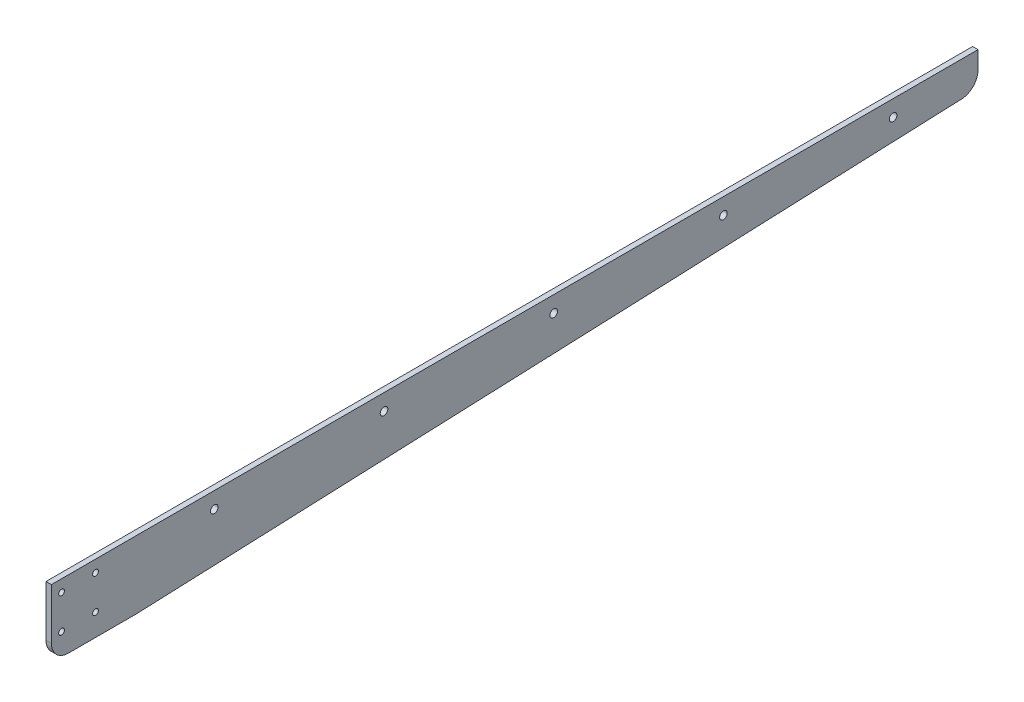
ISO-10303-21;
HEADER;
FILE_DESCRIPTION(('STEP AP214'),'2;1');
FILE_NAME('part.step','',(''),(''),'','','');
FILE_SCHEMA(('AUTOMOTIVE_DESIGN { 1 0 10303 214 1 1 1 1 }'));
ENDSEC;
DATA;
#1=APPLICATION_CONTEXT('core data for automotive mechanical design processes');
#2=APPLICATION_PROTOCOL_DEFINITION('international standard','automotive_design',2000,#1);
#3=PRODUCT_CONTEXT('',#1,'mechanical');
#4=PRODUCT('Part','Part','',(#3));
#5=PRODUCT_RELATED_PRODUCT_CATEGORY('part','',(#4));
#6=PRODUCT_DEFINITION_FORMATION('','',#4);
#7=PRODUCT_DEFINITION_CONTEXT('part definition',#1,'design');
#8=PRODUCT_DEFINITION('design','',#6,#7);
#9=PRODUCT_DEFINITION_SHAPE('','',#8);
#10=(LENGTH_UNIT() NAMED_UNIT(*) SI_UNIT(.MILLI.,.METRE.));
#11=(NAMED_UNIT(*) PLANE_ANGLE_UNIT() SI_UNIT($,.RADIAN.));
#12=(NAMED_UNIT(*) SI_UNIT($,.STERADIAN.) SOLID_ANGLE_UNIT());
#13=UNCERTAINTY_MEASURE_WITH_UNIT(LENGTH_MEASURE(1.E-05),#10,'distance_accuracy_value','');
#14=(GEOMETRIC_REPRESENTATION_CONTEXT(3) GLOBAL_UNCERTAINTY_ASSIGNED_CONTEXT((#13)) GLOBAL_UNIT_ASSIGNED_CONTEXT((#10,
#11,#12)) REPRESENTATION_CONTEXT('',''));
#15=CARTESIAN_POINT('',(0.,0.,0.));
#16=DIRECTION('',(0.,0.,1.));
#17=DIRECTION('',(1.,0.,0.));
#18=AXIS2_PLACEMENT_3D('',#15,#16,#17);
#19=CARTESIAN_POINT('',(3.175,0.,0.));
#20=DIRECTION('',(-1.,0.,0.));
#21=DIRECTION('',(0.,0.,1.));
#22=AXIS2_PLACEMENT_3D('',#19,#20,#21);
#23=PLANE('',#22);
#24=CARTESIAN_POINT('',(3.175,30.475,-296.));
#25=DIRECTION('',(1.,0.,0.));
#26=DIRECTION('',(0.,0.,-1.));
#27=AXIS2_PLACEMENT_3D('',#24,#25,#26);
#28=CIRCLE('',#27,2.24789999999998);
#29=CARTESIAN_POINT('',(3.175,30.475,-298.2479));
#30=VERTEX_POINT('',#29);
#31=EDGE_CURVE('E254',#30,#30,#28,.T.);
#32=ORIENTED_EDGE('',*,*,#31,.F.);
#33=EDGE_LOOP('',(#32));
#34=FACE_BOUND('',#33,.T.);
#35=CARTESIAN_POINT('',(3.175,30.475,-396.));
#36=DIRECTION('',(1.,0.,0.));
#37=DIRECTION('',(0.,0.,-1.));
#38=AXIS2_PLACEMENT_3D('',#35,#36,#37);
#39=CIRCLE('',#38,2.24789999999998);
#40=CARTESIAN_POINT('',(3.175,30.475,-398.2479));
#41=VERTEX_POINT('',#40);
#42=EDGE_CURVE('E260',#41,#41,#39,.T.);
#43=ORIENTED_EDGE('',*,*,#42,.F.);
#44=EDGE_LOOP('',(#43));
#45=FACE_BOUND('',#44,.T.);
#46=CARTESIAN_POINT('',(3.175,30.475,-496.));
#47=DIRECTION('',(1.,0.,0.));
#48=DIRECTION('',(0.,0.,-1.));
#49=AXIS2_PLACEMENT_3D('',#46,#47,#48);
#50=CIRCLE('',#49,2.24789999999998);
#51=CARTESIAN_POINT('',(3.175,30.475,-498.2479));
#52=VERTEX_POINT('',#51);
#53=EDGE_CURVE('E266',#52,#52,#50,.T.);
#54=ORIENTED_EDGE('',*,*,#53,.F.);
#55=EDGE_LOOP('',(#54));
#56=FACE_BOUND('',#55,.T.);
#57=CARTESIAN_POINT('',(3.175,33.,-26.));
#58=DIRECTION('',(1.,0.,0.));
#59=DIRECTION('',(0.,0.,-1.));
#60=AXIS2_PLACEMENT_3D('',#57,#58,#59);
#61=CIRCLE('',#60,1.7);
#62=CARTESIAN_POINT('',(3.175,33.,-27.7));
#63=VERTEX_POINT('',#62);
#64=EDGE_CURVE('E272',#63,#63,#61,.T.);
#65=ORIENTED_EDGE('',*,*,#64,.F.);
#66=EDGE_LOOP('',(#65));
#67=FACE_BOUND('',#66,.T.);
#68=CARTESIAN_POINT('',(3.175,33.,-6.));
#69=DIRECTION('',(1.,0.,0.));
#70=DIRECTION('',(0.,0.,-1.));
#71=AXIS2_PLACEMENT_3D('',#68,#69,#70);
#72=CIRCLE('',#71,1.7);
#73=CARTESIAN_POINT('',(3.175,33.,-7.7));
#74=VERTEX_POINT('',#73);
#75=EDGE_CURVE('E278',#74,#74,#72,.T.);
#76=ORIENTED_EDGE('',*,*,#75,.F.);
#77=EDGE_LOOP('',(#76));
#78=FACE_BOUND('',#77,.T.);
#79=CARTESIAN_POINT('',(3.175,13.,-26.));
#80=DIRECTION('',(1.,0.,0.));
#81=DIRECTION('',(0.,0.,-1.));
#82=AXIS2_PLACEMENT_3D('',#79,#80,#81);
#83=CIRCLE('',#82,1.7);
#84=CARTESIAN_POINT('',(3.175,13.,-27.7));
#85=VERTEX_POINT('',#84);
#86=EDGE_CURVE('E284',#85,#85,#83,.T.);
#87=ORIENTED_EDGE('',*,*,#86,.F.);
#88=EDGE_LOOP('',(#87));
#89=FACE_BOUND('',#88,.T.);
#90=CARTESIAN_POINT('',(3.175,13.,-6.));
#91=DIRECTION('',(1.,0.,0.));
#92=DIRECTION('',(0.,0.,-1.));
#93=AXIS2_PLACEMENT_3D('',#90,#91,#92);
#94=CIRCLE('',#93,1.7);
#95=CARTESIAN_POINT('',(3.175,13.,-7.7));
#96=VERTEX_POINT('',#95);
#97=EDGE_CURVE('E290',#96,#96,#94,.T.);
#98=ORIENTED_EDGE('',*,*,#97,.F.);
#99=EDGE_LOOP('',(#98));
#100=FACE_BOUND('',#99,.T.);
#101=DIRECTION('',(0.,0.,-1.));
#102=VECTOR('',#101,1.);
#103=CARTESIAN_POINT('',(3.175,0.,-50.));
#104=LINE('',#103,#102);
#105=CARTESIAN_POINT('',(3.175,0.,-10.));
#106=VERTEX_POINT('',#105);
#107=CARTESIAN_POINT('',(3.175,0.,-49.7984689813537));
#108=VERTEX_POINT('',#107);
#109=EDGE_CURVE('E139',#106,#108,#104,.T.);
#110=ORIENTED_EDGE('',*,*,#109,.T.);
#111=CARTESIAN_POINT('',(3.175,10.,-49.7984689813537));
#112=DIRECTION('',(-1.,0.,0.));
#113=DIRECTION('',(0.,0.,1.));
#114=AXIS2_PLACEMENT_3D('',#111,#112,#113);
#115=CIRCLE('',#114,10.);
#116=CARTESIAN_POINT('',(3.175,0.00811965251863028,-50.2013673824619));
#117=VERTEX_POINT('',#116);
#118=EDGE_CURVE('E159',#108,#117,#115,.F.);
#119=ORIENTED_EDGE('',*,*,#118,.T.);
#120=DIRECTION('',(0.,0.040289840110812,-0.999188034748137));
#121=VECTOR('',#120,1.);
#122=CARTESIAN_POINT('',(3.175,20.,-546.));
#123=LINE('',#122,#121);
#124=CARTESIAN_POINT('',(3.175,19.6130200968189,-536.402898401108));
#125=VERTEX_POINT('',#124);
#126=EDGE_CURVE('E108',#117,#125,#123,.T.);
#127=ORIENTED_EDGE('',*,*,#126,.T.);
#128=CARTESIAN_POINT('',(3.175,29.6049004443002,-536.));
#129=DIRECTION('',(-1.,0.,0.));
#130=DIRECTION('',(0.,0.,1.));
#131=AXIS2_PLACEMENT_3D('',#128,#129,#130);
#132=CIRCLE('',#131,10.);
#133=CARTESIAN_POINT('',(3.175,29.6049004443002,-546.));
#134=VERTEX_POINT('',#133);
#135=EDGE_CURVE('E57',#125,#134,#132,.F.);
#136=ORIENTED_EDGE('',*,*,#135,.T.);
#137=DIRECTION('',(0.,1.,0.));
#138=VECTOR('',#137,1.);
#139=CARTESIAN_POINT('',(3.175,40.,-546.));
#140=LINE('',#139,#138);
#141=CARTESIAN_POINT('',(3.175,40.,-546.));
#142=VERTEX_POINT('',#141);
#143=EDGE_CURVE('E99',#134,#142,#140,.T.);
#144=ORIENTED_EDGE('',*,*,#143,.T.);
#145=DIRECTION('',(0.,0.,1.));
#146=VECTOR('',#145,1.);
#147=CARTESIAN_POINT('',(3.175,40.,0.));
#148=LINE('',#147,#146);
#149=CARTESIAN_POINT('',(3.175,40.,0.));
#150=VERTEX_POINT('',#149);
#151=EDGE_CURVE('E104',#142,#150,#148,.T.);
#152=ORIENTED_EDGE('',*,*,#151,.T.);
#153=DIRECTION('',(0.,-1.,0.));
#154=VECTOR('',#153,1.);
#155=CARTESIAN_POINT('',(3.175,0.,0.));
#156=LINE('',#155,#154);
#157=CARTESIAN_POINT('',(3.175,10.,0.));
#158=VERTEX_POINT('',#157);
#159=EDGE_CURVE('E122',#150,#158,#156,.T.);
#160=ORIENTED_EDGE('',*,*,#159,.T.);
#161=CARTESIAN_POINT('',(3.175,10.,-10.));
#162=DIRECTION('',(-1.,0.,0.));
#163=DIRECTION('',(0.,0.,1.));
#164=AXIS2_PLACEMENT_3D('',#161,#162,#163);
#165=CIRCLE('',#164,10.);
#166=EDGE_CURVE('E157',#158,#106,#165,.F.);
#167=ORIENTED_EDGE('',*,*,#166,.T.);
#168=EDGE_LOOP('',(#110,#119,#127,#136,#144,#152,#160,#167));
#169=FACE_BOUND('',#168,.T.);
#170=CARTESIAN_POINT('',(3.175,30.475,-196.));
#171=DIRECTION('',(1.,0.,0.));
#172=DIRECTION('',(0.,0.,-1.));
#173=AXIS2_PLACEMENT_3D('',#170,#171,#172);
#174=CIRCLE('',#173,2.24789999999998);
#175=CARTESIAN_POINT('',(3.175,30.475,-198.2479));
#176=VERTEX_POINT('',#175);
#177=EDGE_CURVE('E246',#176,#176,#174,.T.);
#178=ORIENTED_EDGE('',*,*,#177,.F.);
#179=EDGE_LOOP('',(#178));
#180=FACE_BOUND('',#179,.T.);
#181=CARTESIAN_POINT('',(3.175,30.475,-96.));
#182=DIRECTION('',(1.,0.,0.));
#183=DIRECTION('',(0.,0.,-1.));
#184=AXIS2_PLACEMENT_3D('',#181,#182,#183);
#185=CIRCLE('',#184,2.24789999999998);
#186=CARTESIAN_POINT('',(3.175,30.475,-98.2479));
#187=VERTEX_POINT('',#186);
#188=EDGE_CURVE('E243',#187,#187,#185,.T.);
#189=ORIENTED_EDGE('',*,*,#188,.F.);
#190=EDGE_LOOP('',(#189));
#191=FACE_BOUND('',#190,.T.);
#192=ADVANCED_FACE('F35',(#34,#45,#56,#67,#78,#89,#100,#169,#180,#191),#23,.F.);
#193=CARTESIAN_POINT('',(0.,0.,0.));
#194=DIRECTION('',(-1.,0.,0.));
#195=DIRECTION('',(0.,0.,1.));
#196=AXIS2_PLACEMENT_3D('',#193,#194,#195);
#197=PLANE('',#196);
#198=CARTESIAN_POINT('',(0.,30.475,-96.));
#199=DIRECTION('',(1.,0.,0.));
#200=DIRECTION('',(0.,0.,-1.));
#201=AXIS2_PLACEMENT_3D('',#198,#199,#200);
#202=CIRCLE('',#201,2.2479);
#203=CARTESIAN_POINT('',(0.,30.475,-98.2479));
#204=VERTEX_POINT('',#203);
#205=EDGE_CURVE('E240',#204,#204,#202,.T.);
#206=ORIENTED_EDGE('',*,*,#205,.T.);
#207=EDGE_LOOP('',(#206));
#208=FACE_BOUND('',#207,.T.);
#209=CARTESIAN_POINT('',(0.,30.475,-396.));
#210=DIRECTION('',(1.,0.,0.));
#211=DIRECTION('',(0.,0.,-1.));
#212=AXIS2_PLACEMENT_3D('',#209,#210,#211);
#213=CIRCLE('',#212,2.2479);
#214=CARTESIAN_POINT('',(0.,30.475,-398.2479));
#215=VERTEX_POINT('',#214);
#216=EDGE_CURVE('E263',#215,#215,#213,.T.);
#217=ORIENTED_EDGE('',*,*,#216,.T.);
#218=EDGE_LOOP('',(#217));
#219=FACE_BOUND('',#218,.T.);
#220=CARTESIAN_POINT('',(0.,30.475,-496.));
#221=DIRECTION('',(1.,0.,0.));
#222=DIRECTION('',(0.,0.,-1.));
#223=AXIS2_PLACEMENT_3D('',#220,#221,#222);
#224=CIRCLE('',#223,2.2479);
#225=CARTESIAN_POINT('',(0.,30.475,-498.2479));
#226=VERTEX_POINT('',#225);
#227=EDGE_CURVE('E269',#226,#226,#224,.T.);
#228=ORIENTED_EDGE('',*,*,#227,.T.);
#229=EDGE_LOOP('',(#228));
#230=FACE_BOUND('',#229,.T.);
#231=CARTESIAN_POINT('',(0.,33.,-26.));
#232=DIRECTION('',(1.,0.,0.));
#233=DIRECTION('',(0.,0.,-1.));
#234=AXIS2_PLACEMENT_3D('',#231,#232,#233);
#235=CIRCLE('',#234,1.7);
#236=CARTESIAN_POINT('',(0.,33.,-27.7));
#237=VERTEX_POINT('',#236);
#238=EDGE_CURVE('E275',#237,#237,#235,.T.);
#239=ORIENTED_EDGE('',*,*,#238,.T.);
#240=EDGE_LOOP('',(#239));
#241=FACE_BOUND('',#240,.T.);
#242=CARTESIAN_POINT('',(0.,33.,-6.));
#243=DIRECTION('',(1.,0.,0.));
#244=DIRECTION('',(0.,0.,-1.));
#245=AXIS2_PLACEMENT_3D('',#242,#243,#244);
#246=CIRCLE('',#245,1.7);
#247=CARTESIAN_POINT('',(0.,33.,-7.7));
#248=VERTEX_POINT('',#247);
#249=EDGE_CURVE('E281',#248,#248,#246,.T.);
#250=ORIENTED_EDGE('',*,*,#249,.T.);
#251=EDGE_LOOP('',(#250));
#252=FACE_BOUND('',#251,.T.);
#253=CARTESIAN_POINT('',(0.,13.,-26.));
#254=DIRECTION('',(1.,0.,0.));
#255=DIRECTION('',(0.,0.,-1.));
#256=AXIS2_PLACEMENT_3D('',#253,#254,#255);
#257=CIRCLE('',#256,1.7);
#258=CARTESIAN_POINT('',(0.,13.,-27.7));
#259=VERTEX_POINT('',#258);
#260=EDGE_CURVE('E287',#259,#259,#257,.T.);
#261=ORIENTED_EDGE('',*,*,#260,.T.);
#262=EDGE_LOOP('',(#261));
#263=FACE_BOUND('',#262,.T.);
#264=CARTESIAN_POINT('',(0.,13.,-6.));
#265=DIRECTION('',(1.,0.,0.));
#266=DIRECTION('',(0.,0.,-1.));
#267=AXIS2_PLACEMENT_3D('',#264,#265,#266);
#268=CIRCLE('',#267,1.7);
#269=CARTESIAN_POINT('',(0.,13.,-7.7));
#270=VERTEX_POINT('',#269);
#271=EDGE_CURVE('E131',#270,#270,#268,.T.);
#272=ORIENTED_EDGE('',*,*,#271,.T.);
#273=EDGE_LOOP('',(#272));
#274=FACE_BOUND('',#273,.T.);
#275=DIRECTION('',(0.,0.040289840110812,-0.999188034748137));
#276=VECTOR('',#275,1.);
#277=CARTESIAN_POINT('',(0.,20.,-546.));
#278=LINE('',#277,#276);
#279=CARTESIAN_POINT('',(0.,0.00811965251863028,-50.2013673824619));
#280=VERTEX_POINT('',#279);
#281=CARTESIAN_POINT('',(0.,19.6130200968189,-536.402898401108));
#282=VERTEX_POINT('',#281);
#283=EDGE_CURVE('E130',#280,#282,#278,.T.);
#284=ORIENTED_EDGE('',*,*,#283,.F.);
#285=CARTESIAN_POINT('',(0.,10.,-49.7984689813537));
#286=DIRECTION('',(-1.,0.,0.));
#287=DIRECTION('',(0.,0.,1.));
#288=AXIS2_PLACEMENT_3D('',#285,#286,#287);
#289=CIRCLE('',#288,10.);
#290=CARTESIAN_POINT('',(0.,0.,-49.7984689813537));
#291=VERTEX_POINT('',#290);
#292=EDGE_CURVE('E149',#280,#291,#289,.T.);
#293=ORIENTED_EDGE('',*,*,#292,.T.);
#294=DIRECTION('',(0.,0.,-1.));
#295=VECTOR('',#294,1.);
#296=CARTESIAN_POINT('',(0.,0.,-50.));
#297=LINE('',#296,#295);
#298=CARTESIAN_POINT('',(0.,0.,-10.));
#299=VERTEX_POINT('',#298);
#300=EDGE_CURVE('E127',#299,#291,#297,.T.);
#301=ORIENTED_EDGE('',*,*,#300,.F.);
#302=CARTESIAN_POINT('',(0.,10.,-10.));
#303=DIRECTION('',(-1.,0.,0.));
#304=DIRECTION('',(0.,0.,1.));
#305=AXIS2_PLACEMENT_3D('',#302,#303,#304);
#306=CIRCLE('',#305,10.);
#307=CARTESIAN_POINT('',(0.,10.,0.));
#308=VERTEX_POINT('',#307);
#309=EDGE_CURVE('E147',#299,#308,#306,.T.);
#310=ORIENTED_EDGE('',*,*,#309,.T.);
#311=DIRECTION('',(0.,-1.,0.));
#312=VECTOR('',#311,1.);
#313=CARTESIAN_POINT('',(0.,0.,0.));
#314=LINE('',#313,#312);
#315=CARTESIAN_POINT('',(0.,40.,0.));
#316=VERTEX_POINT('',#315);
#317=EDGE_CURVE('E137',#316,#308,#314,.T.);
#318=ORIENTED_EDGE('',*,*,#317,.F.);
#319=DIRECTION('',(0.,0.,1.));
#320=VECTOR('',#319,1.);
#321=CARTESIAN_POINT('',(0.,40.,0.));
#322=LINE('',#321,#320);
#323=CARTESIAN_POINT('',(0.,40.,-546.));
#324=VERTEX_POINT('',#323);
#325=EDGE_CURVE('E135',#324,#316,#322,.T.);
#326=ORIENTED_EDGE('',*,*,#325,.F.);
#327=DIRECTION('',(0.,1.,0.));
#328=VECTOR('',#327,1.);
#329=CARTESIAN_POINT('',(0.,40.,-546.));
#330=LINE('',#329,#328);
#331=CARTESIAN_POINT('',(0.,29.6049004443002,-546.));
#332=VERTEX_POINT('',#331);
#333=EDGE_CURVE('E114',#332,#324,#330,.T.);
#334=ORIENTED_EDGE('',*,*,#333,.F.);
#335=CARTESIAN_POINT('',(0.,29.6049004443002,-536.));
#336=DIRECTION('',(-1.,0.,0.));
#337=DIRECTION('',(0.,0.,1.));
#338=AXIS2_PLACEMENT_3D('',#335,#336,#337);
#339=CIRCLE('',#338,10.);
#340=EDGE_CURVE('E145',#332,#282,#339,.T.);
#341=ORIENTED_EDGE('',*,*,#340,.T.);
#342=EDGE_LOOP('',(#284,#293,#301,#310,#318,#326,#334,#341));
#343=FACE_BOUND('',#342,.T.);
#344=CARTESIAN_POINT('',(0.,30.475,-296.));
#345=DIRECTION('',(1.,0.,0.));
#346=DIRECTION('',(0.,0.,-1.));
#347=AXIS2_PLACEMENT_3D('',#344,#345,#346);
#348=CIRCLE('',#347,2.2479);
#349=CARTESIAN_POINT('',(0.,30.475,-298.2479));
#350=VERTEX_POINT('',#349);
#351=EDGE_CURVE('E257',#350,#350,#348,.T.);
#352=ORIENTED_EDGE('',*,*,#351,.T.);
#353=EDGE_LOOP('',(#352));
#354=FACE_BOUND('',#353,.T.);
#355=CARTESIAN_POINT('',(0.,30.475,-196.));
#356=DIRECTION('',(1.,0.,0.));
#357=DIRECTION('',(0.,0.,-1.));
#358=AXIS2_PLACEMENT_3D('',#355,#356,#357);
#359=CIRCLE('',#358,2.2479);
#360=CARTESIAN_POINT('',(0.,30.475,-198.2479));
#361=VERTEX_POINT('',#360);
#362=EDGE_CURVE('E251',#361,#361,#359,.T.);
#363=ORIENTED_EDGE('',*,*,#362,.T.);
#364=EDGE_LOOP('',(#363));
#365=FACE_BOUND('',#364,.T.);
#366=ADVANCED_FACE('F173',(#208,#219,#230,#241,#252,#263,#274,#343,#354,#365),#197,.T.);
#367=CARTESIAN_POINT('',(3.175,0.,-50.));
#368=DIRECTION('',(0.,1.,0.));
#369=DIRECTION('',(0.,0.,1.));
#370=AXIS2_PLACEMENT_3D('',#367,#368,#369);
#371=PLANE('',#370);
#372=ORIENTED_EDGE('',*,*,#300,.T.);
#373=DIRECTION('',(-1.,0.,0.));
#374=VECTOR('',#373,1.);
#375=CARTESIAN_POINT('',(3.175,0.,-49.7984689813537));
#376=LINE('',#375,#374);
#377=EDGE_CURVE('E154',#291,#108,#376,.F.);
#378=ORIENTED_EDGE('',*,*,#377,.T.);
#379=ORIENTED_EDGE('',*,*,#109,.F.);
#380=DIRECTION('',(-1.,0.,0.));
#381=VECTOR('',#380,1.);
#382=CARTESIAN_POINT('',(3.175,0.,-10.));
#383=LINE('',#382,#381);
#384=EDGE_CURVE('E151',#106,#299,#383,.T.);
#385=ORIENTED_EDGE('',*,*,#384,.T.);
#386=EDGE_LOOP('',(#372,#378,#379,#385));
#387=FACE_BOUND('',#386,.T.);
#388=ADVANCED_FACE('F176',(#387),#371,.F.);
#389=CARTESIAN_POINT('',(3.175,20.,-546.));
#390=DIRECTION('',(0.,0.999188034748138,0.040289840110812));
#391=DIRECTION('',(0.,-0.040289840110812,0.999188034748138));
#392=AXIS2_PLACEMENT_3D('',#389,#390,#391);
#393=PLANE('',#392);
#394=ORIENTED_EDGE('',*,*,#126,.F.);
#395=DIRECTION('',(-1.,0.,0.));
#396=VECTOR('',#395,1.);
#397=CARTESIAN_POINT('',(3.175,0.00811965251862681,-50.2013673824617));
#398=LINE('',#397,#396);
#399=EDGE_CURVE('E142',#117,#280,#398,.T.);
#400=ORIENTED_EDGE('',*,*,#399,.T.);
#401=ORIENTED_EDGE('',*,*,#283,.T.);
#402=DIRECTION('',(-1.,0.,0.));
#403=VECTOR('',#402,1.);
#404=CARTESIAN_POINT('',(3.175,19.6130200968189,-536.402898401108));
#405=LINE('',#404,#403);
#406=EDGE_CURVE('E117',#282,#125,#405,.F.);
#407=ORIENTED_EDGE('',*,*,#406,.T.);
#408=EDGE_LOOP('',(#394,#400,#401,#407));
#409=FACE_BOUND('',#408,.T.);
#410=ADVANCED_FACE('F167',(#409),#393,.F.);
#411=CARTESIAN_POINT('',(3.175,40.,-546.));
#412=DIRECTION('',(0.,0.,1.));
#413=DIRECTION('',(1.,0.,0.));
#414=AXIS2_PLACEMENT_3D('',#411,#412,#413);
#415=PLANE('',#414);
#416=ORIENTED_EDGE('',*,*,#143,.F.);
#417=DIRECTION('',(-1.,0.,0.));
#418=VECTOR('',#417,1.);
#419=CARTESIAN_POINT('',(3.175,29.6049004443002,-546.));
#420=LINE('',#419,#418);
#421=EDGE_CURVE('E11',#134,#332,#420,.T.);
#422=ORIENTED_EDGE('',*,*,#421,.T.);
#423=ORIENTED_EDGE('',*,*,#333,.T.);
#424=DIRECTION('',(-1.,0.,0.));
#425=VECTOR('',#424,1.);
#426=CARTESIAN_POINT('',(3.175,40.,-546.));
#427=LINE('',#426,#425);
#428=EDGE_CURVE('E111',#142,#324,#427,.T.);
#429=ORIENTED_EDGE('',*,*,#428,.F.);
#430=EDGE_LOOP('',(#416,#422,#423,#429));
#431=FACE_BOUND('',#430,.T.);
#432=ADVANCED_FACE('F112',(#431),#415,.F.);
#433=CARTESIAN_POINT('',(3.175,40.,0.));
#434=DIRECTION('',(0.,-1.,0.));
#435=DIRECTION('',(0.,0.,-1.));
#436=AXIS2_PLACEMENT_3D('',#433,#434,#435);
#437=PLANE('',#436);
#438=ORIENTED_EDGE('',*,*,#325,.T.);
#439=DIRECTION('',(-1.,0.,0.));
#440=VECTOR('',#439,1.);
#441=CARTESIAN_POINT('',(3.175,40.,0.));
#442=LINE('',#441,#440);
#443=EDGE_CURVE('E118',#150,#316,#442,.T.);
#444=ORIENTED_EDGE('',*,*,#443,.F.);
#445=ORIENTED_EDGE('',*,*,#151,.F.);
#446=ORIENTED_EDGE('',*,*,#428,.T.);
#447=EDGE_LOOP('',(#438,#444,#445,#446));
#448=FACE_BOUND('',#447,.T.);
#449=ADVANCED_FACE('F120',(#448),#437,.F.);
#450=CARTESIAN_POINT('',(3.175,0.,0.));
#451=DIRECTION('',(0.,0.,-1.));
#452=DIRECTION('',(-1.,0.,0.));
#453=AXIS2_PLACEMENT_3D('',#450,#451,#452);
#454=PLANE('',#453);
#455=ORIENTED_EDGE('',*,*,#317,.T.);
#456=DIRECTION('',(-1.,0.,0.));
#457=VECTOR('',#456,1.);
#458=CARTESIAN_POINT('',(3.175,10.,0.));
#459=LINE('',#458,#457);
#460=EDGE_CURVE('E43',#308,#158,#459,.F.);
#461=ORIENTED_EDGE('',*,*,#460,.T.);
#462=ORIENTED_EDGE('',*,*,#159,.F.);
#463=ORIENTED_EDGE('',*,*,#443,.T.);
#464=EDGE_LOOP('',(#455,#461,#462,#463));
#465=FACE_BOUND('',#464,.T.);
#466=ADVANCED_FACE('F182',(#465),#454,.F.);
#467=CARTESIAN_POINT('',(3.175,13.,-6.));
#468=DIRECTION('',(1.,0.,0.));
#469=DIRECTION('',(0.,0.,-1.));
#470=AXIS2_PLACEMENT_3D('',#467,#468,#469);
#471=CYLINDRICAL_SURFACE('',#470,1.7);
#472=ORIENTED_EDGE('',*,*,#271,.F.);
#473=EDGE_LOOP('',(#472));
#474=FACE_BOUND('',#473,.T.);
#475=ORIENTED_EDGE('',*,*,#97,.T.);
#476=EDGE_LOOP('',(#475));
#477=FACE_BOUND('',#476,.T.);
#478=ADVANCED_FACE('F184',(#474,#477),#471,.F.);
#479=CARTESIAN_POINT('',(3.175,13.,-26.));
#480=DIRECTION('',(1.,0.,0.));
#481=DIRECTION('',(0.,0.,-1.));
#482=AXIS2_PLACEMENT_3D('',#479,#480,#481);
#483=CYLINDRICAL_SURFACE('',#482,1.7);
#484=ORIENTED_EDGE('',*,*,#260,.F.);
#485=EDGE_LOOP('',(#484));
#486=FACE_BOUND('',#485,.T.);
#487=ORIENTED_EDGE('',*,*,#86,.T.);
#488=EDGE_LOOP('',(#487));
#489=FACE_BOUND('',#488,.T.);
#490=ADVANCED_FACE('F190',(#486,#489),#483,.F.);
#491=CARTESIAN_POINT('',(3.175,33.,-6.));
#492=DIRECTION('',(1.,0.,0.));
#493=DIRECTION('',(0.,0.,-1.));
#494=AXIS2_PLACEMENT_3D('',#491,#492,#493);
#495=CYLINDRICAL_SURFACE('',#494,1.7);
#496=ORIENTED_EDGE('',*,*,#249,.F.);
#497=EDGE_LOOP('',(#496));
#498=FACE_BOUND('',#497,.T.);
#499=ORIENTED_EDGE('',*,*,#75,.T.);
#500=EDGE_LOOP('',(#499));
#501=FACE_BOUND('',#500,.T.);
#502=ADVANCED_FACE('F207',(#498,#501),#495,.F.);
#503=CARTESIAN_POINT('',(3.175,33.,-26.));
#504=DIRECTION('',(1.,0.,0.));
#505=DIRECTION('',(0.,0.,-1.));
#506=AXIS2_PLACEMENT_3D('',#503,#504,#505);
#507=CYLINDRICAL_SURFACE('',#506,1.7);
#508=ORIENTED_EDGE('',*,*,#238,.F.);
#509=EDGE_LOOP('',(#508));
#510=FACE_BOUND('',#509,.T.);
#511=ORIENTED_EDGE('',*,*,#64,.T.);
#512=EDGE_LOOP('',(#511));
#513=FACE_BOUND('',#512,.T.);
#514=ADVANCED_FACE('F211',(#510,#513),#507,.F.);
#515=CARTESIAN_POINT('',(3.175,10.,-49.7984689813537));
#516=DIRECTION('',(-1.,0.,0.));
#517=DIRECTION('',(0.,0.,1.));
#518=AXIS2_PLACEMENT_3D('',#515,#516,#517);
#519=CYLINDRICAL_SURFACE('',#518,10.);
#520=ORIENTED_EDGE('',*,*,#118,.F.);
#521=ORIENTED_EDGE('',*,*,#377,.F.);
#522=ORIENTED_EDGE('',*,*,#292,.F.);
#523=ORIENTED_EDGE('',*,*,#399,.F.);
#524=EDGE_LOOP('',(#520,#521,#522,#523));
#525=FACE_BOUND('',#524,.T.);
#526=ADVANCED_FACE('F170',(#525),#519,.T.);
#527=CARTESIAN_POINT('',(3.175,10.,-10.));
#528=DIRECTION('',(-1.,0.,0.));
#529=DIRECTION('',(0.,0.,1.));
#530=AXIS2_PLACEMENT_3D('',#527,#528,#529);
#531=CYLINDRICAL_SURFACE('',#530,10.);
#532=ORIENTED_EDGE('',*,*,#166,.F.);
#533=ORIENTED_EDGE('',*,*,#460,.F.);
#534=ORIENTED_EDGE('',*,*,#309,.F.);
#535=ORIENTED_EDGE('',*,*,#384,.F.);
#536=EDGE_LOOP('',(#532,#533,#534,#535));
#537=FACE_BOUND('',#536,.T.);
#538=ADVANCED_FACE('F180',(#537),#531,.T.);
#539=CARTESIAN_POINT('',(3.175,29.6049004443002,-536.));
#540=DIRECTION('',(-1.,0.,0.));
#541=DIRECTION('',(0.,0.,1.));
#542=AXIS2_PLACEMENT_3D('',#539,#540,#541);
#543=CYLINDRICAL_SURFACE('',#542,10.);
#544=ORIENTED_EDGE('',*,*,#135,.F.);
#545=ORIENTED_EDGE('',*,*,#406,.F.);
#546=ORIENTED_EDGE('',*,*,#340,.F.);
#547=ORIENTED_EDGE('',*,*,#421,.F.);
#548=EDGE_LOOP('',(#544,#545,#546,#547));
#549=FACE_BOUND('',#548,.T.);
#550=ADVANCED_FACE('F37',(#549),#543,.T.);
#551=CARTESIAN_POINT('',(3.175,30.475,-496.));
#552=DIRECTION('',(1.,0.,0.));
#553=DIRECTION('',(0.,0.,-1.));
#554=AXIS2_PLACEMENT_3D('',#551,#552,#553);
#555=CYLINDRICAL_SURFACE('',#554,2.24789999999999);
#556=ORIENTED_EDGE('',*,*,#227,.F.);
#557=EDGE_LOOP('',(#556));
#558=FACE_BOUND('',#557,.T.);
#559=ORIENTED_EDGE('',*,*,#53,.T.);
#560=EDGE_LOOP('',(#559));
#561=FACE_BOUND('',#560,.T.);
#562=ADVANCED_FACE('F216',(#558,#561),#555,.F.);
#563=CARTESIAN_POINT('',(3.175,30.475,-396.));
#564=DIRECTION('',(1.,0.,0.));
#565=DIRECTION('',(0.,0.,-1.));
#566=AXIS2_PLACEMENT_3D('',#563,#564,#565);
#567=CYLINDRICAL_SURFACE('',#566,2.24789999999999);
#568=ORIENTED_EDGE('',*,*,#216,.F.);
#569=EDGE_LOOP('',(#568));
#570=FACE_BOUND('',#569,.T.);
#571=ORIENTED_EDGE('',*,*,#42,.T.);
#572=EDGE_LOOP('',(#571));
#573=FACE_BOUND('',#572,.T.);
#574=ADVANCED_FACE('F219',(#570,#573),#567,.F.);
#575=CARTESIAN_POINT('',(3.175,30.475,-296.));
#576=DIRECTION('',(1.,0.,0.));
#577=DIRECTION('',(0.,0.,-1.));
#578=AXIS2_PLACEMENT_3D('',#575,#576,#577);
#579=CYLINDRICAL_SURFACE('',#578,2.24789999999999);
#580=ORIENTED_EDGE('',*,*,#351,.F.);
#581=EDGE_LOOP('',(#580));
#582=FACE_BOUND('',#581,.T.);
#583=ORIENTED_EDGE('',*,*,#31,.T.);
#584=EDGE_LOOP('',(#583));
#585=FACE_BOUND('',#584,.T.);
#586=ADVANCED_FACE('F223',(#582,#585),#579,.F.);
#587=CARTESIAN_POINT('',(3.175,30.475,-196.));
#588=DIRECTION('',(1.,0.,0.));
#589=DIRECTION('',(0.,0.,-1.));
#590=AXIS2_PLACEMENT_3D('',#587,#588,#589);
#591=CYLINDRICAL_SURFACE('',#590,2.24789999999999);
#592=ORIENTED_EDGE('',*,*,#362,.F.);
#593=EDGE_LOOP('',(#592));
#594=FACE_BOUND('',#593,.T.);
#595=ORIENTED_EDGE('',*,*,#177,.T.);
#596=EDGE_LOOP('',(#595));
#597=FACE_BOUND('',#596,.T.);
#598=ADVANCED_FACE('F227',(#594,#597),#591,.F.);
#599=CARTESIAN_POINT('',(3.175,30.475,-96.));
#600=DIRECTION('',(1.,0.,0.));
#601=DIRECTION('',(0.,0.,-1.));
#602=AXIS2_PLACEMENT_3D('',#599,#600,#601);
#603=CYLINDRICAL_SURFACE('',#602,2.24789999999999);
#604=ORIENTED_EDGE('',*,*,#205,.F.);
#605=EDGE_LOOP('',(#604));
#606=FACE_BOUND('',#605,.T.);
#607=ORIENTED_EDGE('',*,*,#188,.T.);
#608=EDGE_LOOP('',(#607));
#609=FACE_BOUND('',#608,.T.);
#610=ADVANCED_FACE('F231',(#606,#609),#603,.F.);
#611=CLOSED_SHELL('',(#192,#366,#388,#410,#432,#449,#466,#478,#490,#502,#514,#526,#538,#550,
#562,#574,#586,#598,#610));
#612=MANIFOLD_SOLID_BREP('B2',#611);
#613=ADVANCED_BREP_SHAPE_REPRESENTATION('',(#18,#612),#14);
#614=SHAPE_DEFINITION_REPRESENTATION(#9,#613);
ENDSEC;
END-ISO-10303-21;
